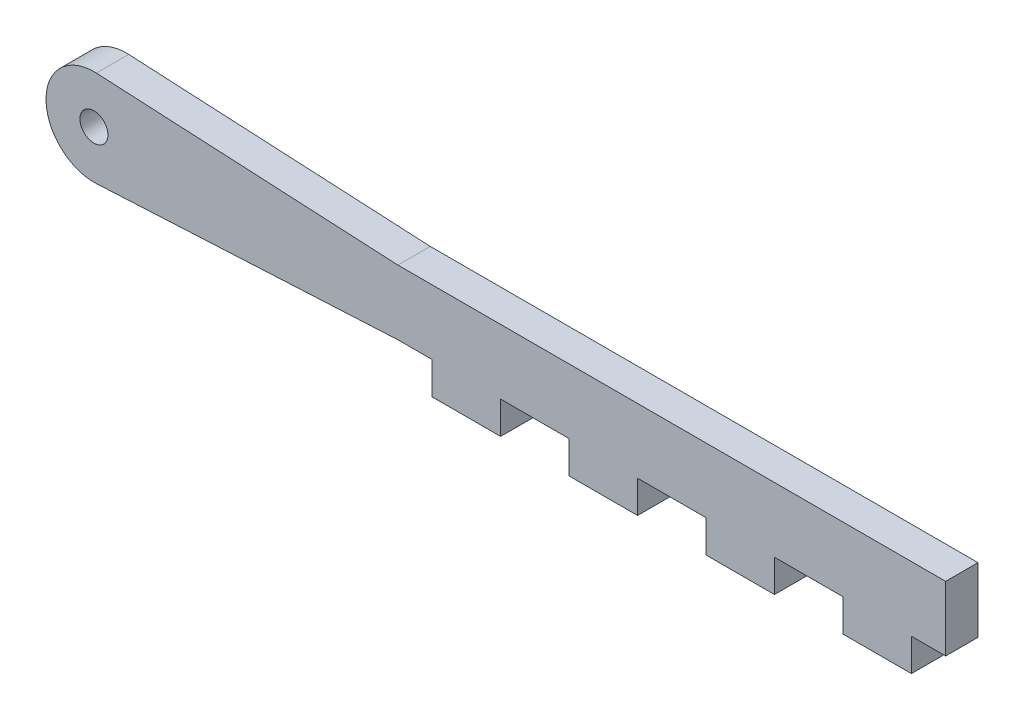
ISO-10303-21;
HEADER;
FILE_DESCRIPTION(('STEP AP214'),'2;1');
FILE_NAME('part.step','',(''),(''),'','','');
FILE_SCHEMA(('AUTOMOTIVE_DESIGN { 1 0 10303 214 1 1 1 1 }'));
ENDSEC;
DATA;
#1=APPLICATION_CONTEXT('core data for automotive mechanical design processes');
#2=APPLICATION_PROTOCOL_DEFINITION('international standard','automotive_design',2000,#1);
#3=PRODUCT_CONTEXT('',#1,'mechanical');
#4=PRODUCT('Part','Part','',(#3));
#5=PRODUCT_RELATED_PRODUCT_CATEGORY('part','',(#4));
#6=PRODUCT_DEFINITION_FORMATION('','',#4);
#7=PRODUCT_DEFINITION_CONTEXT('part definition',#1,'design');
#8=PRODUCT_DEFINITION('design','',#6,#7);
#9=PRODUCT_DEFINITION_SHAPE('','',#8);
#10=(LENGTH_UNIT() NAMED_UNIT(*) SI_UNIT(.MILLI.,.METRE.));
#11=(NAMED_UNIT(*) PLANE_ANGLE_UNIT() SI_UNIT($,.RADIAN.));
#12=(NAMED_UNIT(*) SI_UNIT($,.STERADIAN.) SOLID_ANGLE_UNIT());
#13=UNCERTAINTY_MEASURE_WITH_UNIT(LENGTH_MEASURE(1.E-05),#10,'distance_accuracy_value','');
#14=(GEOMETRIC_REPRESENTATION_CONTEXT(3) GLOBAL_UNCERTAINTY_ASSIGNED_CONTEXT((#13)) GLOBAL_UNIT_ASSIGNED_CONTEXT((#10,
#11,#12)) REPRESENTATION_CONTEXT('',''));
#15=CARTESIAN_POINT('',(0.,0.,0.));
#16=DIRECTION('',(0.,0.,1.));
#17=DIRECTION('',(1.,0.,0.));
#18=AXIS2_PLACEMENT_3D('',#15,#16,#17);
#19=CARTESIAN_POINT('',(50.8,0.,3.));
#20=DIRECTION('',(0.,1.,0.));
#21=DIRECTION('',(-1.,0.,0.));
#22=AXIS2_PLACEMENT_3D('',#19,#20,#21);
#23=PLANE('',#22);
#24=DIRECTION('',(0.,0.,-1.));
#25=VECTOR('',#24,1.);
#26=CARTESIAN_POINT('',(15.875,0.,3.));
#27=LINE('',#26,#25);
#28=CARTESIAN_POINT('',(15.875,0.,3.));
#29=VERTEX_POINT('',#28);
#30=CARTESIAN_POINT('',(15.875,0.,0.));
#31=VERTEX_POINT('',#30);
#32=EDGE_CURVE('E228',#29,#31,#27,.T.);
#33=ORIENTED_EDGE('',*,*,#32,.F.);
#34=DIRECTION('',(1.,0.,0.));
#35=VECTOR('',#34,1.);
#36=CARTESIAN_POINT('',(50.8,0.,3.));
#37=LINE('',#36,#35);
#38=CARTESIAN_POINT('',(9.525,0.,3.));
#39=VERTEX_POINT('',#38);
#40=EDGE_CURVE('E368',#39,#29,#37,.T.);
#41=ORIENTED_EDGE('',*,*,#40,.F.);
#42=DIRECTION('',(0.,0.,1.));
#43=VECTOR('',#42,1.);
#44=CARTESIAN_POINT('',(9.525,0.,3.));
#45=LINE('',#44,#43);
#46=CARTESIAN_POINT('',(9.525,0.,0.));
#47=VERTEX_POINT('',#46);
#48=EDGE_CURVE('E235',#47,#39,#45,.T.);
#49=ORIENTED_EDGE('',*,*,#48,.F.);
#50=DIRECTION('',(1.,0.,0.));
#51=VECTOR('',#50,1.);
#52=CARTESIAN_POINT('',(50.8,0.,0.));
#53=LINE('',#52,#51);
#54=EDGE_CURVE('E389',#47,#31,#53,.T.);
#55=ORIENTED_EDGE('',*,*,#54,.T.);
#56=EDGE_LOOP('',(#33,#41,#49,#55));
#57=FACE_BOUND('',#56,.T.);
#58=ADVANCED_FACE('F49',(#57),#23,.F.);
#59=DIRECTION('',(0.,0.,1.));
#60=VECTOR('',#59,1.);
#61=CARTESIAN_POINT('',(22.225,0.,3.));
#62=LINE('',#61,#60);
#63=CARTESIAN_POINT('',(22.225,0.,0.));
#64=VERTEX_POINT('',#63);
#65=CARTESIAN_POINT('',(22.225,0.,3.));
#66=VERTEX_POINT('',#65);
#67=EDGE_CURVE('E225',#64,#66,#62,.T.);
#68=ORIENTED_EDGE('',*,*,#67,.F.);
#69=CARTESIAN_POINT('',(28.575,0.,0.));
#70=VERTEX_POINT('',#69);
#71=EDGE_CURVE('E445',#64,#70,#53,.T.);
#72=ORIENTED_EDGE('',*,*,#71,.T.);
#73=DIRECTION('',(0.,0.,-1.));
#74=VECTOR('',#73,1.);
#75=CARTESIAN_POINT('',(28.575,0.,3.));
#76=LINE('',#75,#74);
#77=CARTESIAN_POINT('',(28.575,0.,3.));
#78=VERTEX_POINT('',#77);
#79=EDGE_CURVE('E256',#78,#70,#76,.T.);
#80=ORIENTED_EDGE('',*,*,#79,.F.);
#81=EDGE_CURVE('E509',#66,#78,#37,.T.);
#82=ORIENTED_EDGE('',*,*,#81,.F.);
#83=EDGE_LOOP('',(#68,#72,#80,#82));
#84=FACE_BOUND('',#83,.T.);
#85=ADVANCED_FACE('F477',(#84),#23,.F.);
#86=DIRECTION('',(0.,0.,1.));
#87=VECTOR('',#86,1.);
#88=CARTESIAN_POINT('',(34.925,0.,3.));
#89=LINE('',#88,#87);
#90=CARTESIAN_POINT('',(34.925,0.,0.));
#91=VERTEX_POINT('',#90);
#92=CARTESIAN_POINT('',(34.925,0.,3.));
#93=VERTEX_POINT('',#92);
#94=EDGE_CURVE('E246',#91,#93,#89,.T.);
#95=ORIENTED_EDGE('',*,*,#94,.F.);
#96=CARTESIAN_POINT('',(41.275,0.,0.));
#97=VERTEX_POINT('',#96);
#98=EDGE_CURVE('E443',#91,#97,#53,.T.);
#99=ORIENTED_EDGE('',*,*,#98,.T.);
#100=DIRECTION('',(0.,0.,-1.));
#101=VECTOR('',#100,1.);
#102=CARTESIAN_POINT('',(41.275,0.,3.));
#103=LINE('',#102,#101);
#104=CARTESIAN_POINT('',(41.275,0.,3.));
#105=VERTEX_POINT('',#104);
#106=EDGE_CURVE('E73',#105,#97,#103,.T.);
#107=ORIENTED_EDGE('',*,*,#106,.F.);
#108=EDGE_CURVE('E495',#93,#105,#37,.T.);
#109=ORIENTED_EDGE('',*,*,#108,.F.);
#110=EDGE_LOOP('',(#95,#99,#107,#109));
#111=FACE_BOUND('',#110,.T.);
#112=ADVANCED_FACE('F483',(#111),#23,.F.);
#113=DIRECTION('',(0.,0.,1.));
#114=VECTOR('',#113,1.);
#115=CARTESIAN_POINT('',(47.625,0.,3.));
#116=LINE('',#115,#114);
#117=CARTESIAN_POINT('',(47.625,0.,0.));
#118=VERTEX_POINT('',#117);
#119=CARTESIAN_POINT('',(47.625,0.,3.));
#120=VERTEX_POINT('',#119);
#121=EDGE_CURVE('E284',#118,#120,#116,.T.);
#122=ORIENTED_EDGE('',*,*,#121,.F.);
#123=CARTESIAN_POINT('',(50.8,0.,0.));
#124=VERTEX_POINT('',#123);
#125=EDGE_CURVE('E384',#118,#124,#53,.T.);
#126=ORIENTED_EDGE('',*,*,#125,.T.);
#127=DIRECTION('',(0.,0.,-1.));
#128=VECTOR('',#127,1.);
#129=CARTESIAN_POINT('',(50.8,0.,3.));
#130=LINE('',#129,#128);
#131=CARTESIAN_POINT('',(50.8,0.,3.));
#132=VERTEX_POINT('',#131);
#133=EDGE_CURVE('E395',#132,#124,#130,.T.);
#134=ORIENTED_EDGE('',*,*,#133,.F.);
#135=EDGE_CURVE('E65',#120,#132,#37,.T.);
#136=ORIENTED_EDGE('',*,*,#135,.F.);
#137=EDGE_LOOP('',(#122,#126,#134,#136));
#138=FACE_BOUND('',#137,.T.);
#139=ADVANCED_FACE('F441',(#138),#23,.F.);
#140=DIRECTION('',(0.,0.,-1.));
#141=VECTOR('',#140,1.);
#142=CARTESIAN_POINT('',(3.175,0.,3.));
#143=LINE('',#142,#141);
#144=CARTESIAN_POINT('',(3.175,0.,3.));
#145=VERTEX_POINT('',#144);
#146=CARTESIAN_POINT('',(3.175,0.,0.));
#147=VERTEX_POINT('',#146);
#148=EDGE_CURVE('E230',#145,#147,#143,.T.);
#149=ORIENTED_EDGE('',*,*,#148,.F.);
#150=CARTESIAN_POINT('',(0.,0.,3.));
#151=VERTEX_POINT('',#150);
#152=EDGE_CURVE('E363',#151,#145,#37,.T.);
#153=ORIENTED_EDGE('',*,*,#152,.F.);
#154=DIRECTION('',(0.,0.,-1.));
#155=VECTOR('',#154,1.);
#156=CARTESIAN_POINT('',(0.,0.,3.));
#157=LINE('',#156,#155);
#158=CARTESIAN_POINT('',(0.,0.,0.));
#159=VERTEX_POINT('',#158);
#160=EDGE_CURVE('E399',#151,#159,#157,.T.);
#161=ORIENTED_EDGE('',*,*,#160,.T.);
#162=EDGE_CURVE('E385',#159,#147,#53,.T.);
#163=ORIENTED_EDGE('',*,*,#162,.T.);
#164=EDGE_LOOP('',(#149,#153,#161,#163));
#165=FACE_BOUND('',#164,.T.);
#166=ADVANCED_FACE('F424',(#165),#23,.F.);
#167=CARTESIAN_POINT('',(-28.194,3.,3.));
#168=DIRECTION('',(0.,0.,1.));
#169=DIRECTION('',(1.,0.,0.));
#170=AXIS2_PLACEMENT_3D('',#167,#168,#169);
#171=PLANE('',#170);
#172=DIRECTION('',(-1.,0.,0.));
#173=VECTOR('',#172,1.);
#174=CARTESIAN_POINT('',(50.8,6.,3.));
#175=LINE('',#174,#173);
#176=CARTESIAN_POINT('',(50.8,6.,3.));
#177=VERTEX_POINT('',#176);
#178=CARTESIAN_POINT('',(0.,5.99999999999999,3.));
#179=VERTEX_POINT('',#178);
#180=EDGE_CURVE('E349',#177,#179,#175,.T.);
#181=ORIENTED_EDGE('',*,*,#180,.T.);
#182=DIRECTION('',(-0.998678524518852,0.0513926518565458,0.));
#183=VECTOR('',#182,1.);
#184=CARTESIAN_POINT('',(0.,5.99999999999999,3.));
#185=LINE('',#184,#183);
#186=CARTESIAN_POINT('',(-27.9655596624977,7.4391260414863,3.));
#187=VERTEX_POINT('',#186);
#188=EDGE_CURVE('E353',#179,#187,#185,.T.);
#189=ORIENTED_EDGE('',*,*,#188,.T.);
#190=CARTESIAN_POINT('',(-28.194,3.,3.));
#191=DIRECTION('',(0.,0.,1.));
#192=DIRECTION('',(1.,0.,0.));
#193=AXIS2_PLACEMENT_3D('',#190,#191,#192);
#194=CIRCLE('',#193,4.445);
#195=CARTESIAN_POINT('',(-27.9655596624977,-1.4391260414863,3.));
#196=VERTEX_POINT('',#195);
#197=EDGE_CURVE('E357',#187,#196,#194,.T.);
#198=ORIENTED_EDGE('',*,*,#197,.T.);
#199=DIRECTION('',(0.998678524518852,0.0513926518565454,0.));
#200=VECTOR('',#199,1.);
#201=CARTESIAN_POINT('',(0.,0.,3.));
#202=LINE('',#201,#200);
#203=EDGE_CURVE('E360',#196,#151,#202,.T.);
#204=ORIENTED_EDGE('',*,*,#203,.T.);
#205=ORIENTED_EDGE('',*,*,#152,.T.);
#206=DIRECTION('',(0.,1.,0.));
#207=VECTOR('',#206,1.);
#208=CARTESIAN_POINT('',(3.175,-3.,3.));
#209=LINE('',#208,#207);
#210=CARTESIAN_POINT('',(3.175,-3.,3.));
#211=VERTEX_POINT('',#210);
#212=EDGE_CURVE('E324',#211,#145,#209,.T.);
#213=ORIENTED_EDGE('',*,*,#212,.F.);
#214=DIRECTION('',(-1.,0.,0.));
#215=VECTOR('',#214,1.);
#216=CARTESIAN_POINT('',(3.175,-3.,3.));
#217=LINE('',#216,#215);
#218=CARTESIAN_POINT('',(9.525,-3.,3.));
#219=VERTEX_POINT('',#218);
#220=EDGE_CURVE('E322',#219,#211,#217,.T.);
#221=ORIENTED_EDGE('',*,*,#220,.F.);
#222=DIRECTION('',(0.,1.,0.));
#223=VECTOR('',#222,1.);
#224=CARTESIAN_POINT('',(9.525,-3.,3.));
#225=LINE('',#224,#223);
#226=EDGE_CURVE('E331',#219,#39,#225,.T.);
#227=ORIENTED_EDGE('',*,*,#226,.T.);
#228=ORIENTED_EDGE('',*,*,#40,.T.);
#229=DIRECTION('',(0.,1.,0.));
#230=VECTOR('',#229,1.);
#231=CARTESIAN_POINT('',(15.875,-3.,3.));
#232=LINE('',#231,#230);
#233=CARTESIAN_POINT('',(15.875,-3.,3.));
#234=VERTEX_POINT('',#233);
#235=EDGE_CURVE('E710',#234,#29,#232,.T.);
#236=ORIENTED_EDGE('',*,*,#235,.F.);
#237=DIRECTION('',(-1.,0.,0.));
#238=VECTOR('',#237,1.);
#239=CARTESIAN_POINT('',(15.875,-3.,3.));
#240=LINE('',#239,#238);
#241=CARTESIAN_POINT('',(22.225,-3.,3.));
#242=VERTEX_POINT('',#241);
#243=EDGE_CURVE('E220',#242,#234,#240,.T.);
#244=ORIENTED_EDGE('',*,*,#243,.F.);
#245=DIRECTION('',(0.,1.,0.));
#246=VECTOR('',#245,1.);
#247=CARTESIAN_POINT('',(22.225,-3.,3.));
#248=LINE('',#247,#246);
#249=EDGE_CURVE('E237',#242,#66,#248,.T.);
#250=ORIENTED_EDGE('',*,*,#249,.T.);
#251=ORIENTED_EDGE('',*,*,#81,.T.);
#252=DIRECTION('',(0.,1.,0.));
#253=VECTOR('',#252,1.);
#254=CARTESIAN_POINT('',(28.575,-3.,3.));
#255=LINE('',#254,#253);
#256=CARTESIAN_POINT('',(28.575,-3.,3.));
#257=VERTEX_POINT('',#256);
#258=EDGE_CURVE('E255',#257,#78,#255,.T.);
#259=ORIENTED_EDGE('',*,*,#258,.F.);
#260=DIRECTION('',(-1.,0.,0.));
#261=VECTOR('',#260,1.);
#262=CARTESIAN_POINT('',(28.575,-3.,3.));
#263=LINE('',#262,#261);
#264=CARTESIAN_POINT('',(34.925,-3.,3.));
#265=VERTEX_POINT('',#264);
#266=EDGE_CURVE('E252',#265,#257,#263,.T.);
#267=ORIENTED_EDGE('',*,*,#266,.F.);
#268=DIRECTION('',(0.,1.,0.));
#269=VECTOR('',#268,1.);
#270=CARTESIAN_POINT('',(34.925,-3.,3.));
#271=LINE('',#270,#269);
#272=EDGE_CURVE('E267',#265,#93,#271,.T.);
#273=ORIENTED_EDGE('',*,*,#272,.T.);
#274=ORIENTED_EDGE('',*,*,#108,.T.);
#275=DIRECTION('',(0.,1.,0.));
#276=VECTOR('',#275,1.);
#277=CARTESIAN_POINT('',(41.275,-3.,3.));
#278=LINE('',#277,#276);
#279=CARTESIAN_POINT('',(41.275,-3.,3.));
#280=VERTEX_POINT('',#279);
#281=EDGE_CURVE('E293',#280,#105,#278,.T.);
#282=ORIENTED_EDGE('',*,*,#281,.F.);
#283=DIRECTION('',(-1.,0.,0.));
#284=VECTOR('',#283,1.);
#285=CARTESIAN_POINT('',(41.275,-3.,3.));
#286=LINE('',#285,#284);
#287=CARTESIAN_POINT('',(47.625,-3.,3.));
#288=VERTEX_POINT('',#287);
#289=EDGE_CURVE('E290',#288,#280,#286,.T.);
#290=ORIENTED_EDGE('',*,*,#289,.F.);
#291=DIRECTION('',(0.,1.,0.));
#292=VECTOR('',#291,1.);
#293=CARTESIAN_POINT('',(47.625,-3.,3.));
#294=LINE('',#293,#292);
#295=EDGE_CURVE('E301',#288,#120,#294,.T.);
#296=ORIENTED_EDGE('',*,*,#295,.T.);
#297=ORIENTED_EDGE('',*,*,#135,.T.);
#298=DIRECTION('',(0.,1.,0.));
#299=VECTOR('',#298,1.);
#300=CARTESIAN_POINT('',(50.8,0.,3.));
#301=LINE('',#300,#299);
#302=EDGE_CURVE('E367',#132,#177,#301,.T.);
#303=ORIENTED_EDGE('',*,*,#302,.T.);
#304=EDGE_LOOP('',(#181,#189,#198,#204,#205,#213,#221,#227,#228,#236,#244,#250,#251,#259,#267,
#273,#274,#282,#290,#296,#297,#303));
#305=FACE_BOUND('',#304,.T.);
#306=CARTESIAN_POINT('',(-28.194,3.,3.));
#307=DIRECTION('',(0.,0.,1.));
#308=DIRECTION('',(1.,0.,0.));
#309=AXIS2_PLACEMENT_3D('',#306,#307,#308);
#310=CIRCLE('',#309,1.29999999999999);
#311=CARTESIAN_POINT('',(-26.894,3.,3.));
#312=VERTEX_POINT('',#311);
#313=EDGE_CURVE('E341',#312,#312,#310,.T.);
#314=ORIENTED_EDGE('',*,*,#313,.F.);
#315=EDGE_LOOP('',(#314));
#316=FACE_BOUND('',#315,.T.);
#317=ADVANCED_FACE('F427',(#305,#316),#171,.T.);
#318=CARTESIAN_POINT('',(-28.194,3.,0.));
#319=DIRECTION('',(0.,0.,1.));
#320=DIRECTION('',(1.,0.,0.));
#321=AXIS2_PLACEMENT_3D('',#318,#319,#320);
#322=PLANE('',#321);
#323=DIRECTION('',(-1.,0.,0.));
#324=VECTOR('',#323,1.);
#325=CARTESIAN_POINT('',(50.8,6.,0.));
#326=LINE('',#325,#324);
#327=CARTESIAN_POINT('',(50.8,6.,0.));
#328=VERTEX_POINT('',#327);
#329=CARTESIAN_POINT('',(0.,5.99999999999999,0.));
#330=VERTEX_POINT('',#329);
#331=EDGE_CURVE('E345',#328,#330,#326,.T.);
#332=ORIENTED_EDGE('',*,*,#331,.F.);
#333=DIRECTION('',(0.,1.,0.));
#334=VECTOR('',#333,1.);
#335=CARTESIAN_POINT('',(50.8,0.,0.));
#336=LINE('',#335,#334);
#337=EDGE_CURVE('E354',#124,#328,#336,.T.);
#338=ORIENTED_EDGE('',*,*,#337,.F.);
#339=ORIENTED_EDGE('',*,*,#125,.F.);
#340=DIRECTION('',(0.,1.,0.));
#341=VECTOR('',#340,1.);
#342=CARTESIAN_POINT('',(47.625,-3.,0.));
#343=LINE('',#342,#341);
#344=CARTESIAN_POINT('',(47.625,-3.,0.));
#345=VERTEX_POINT('',#344);
#346=EDGE_CURVE('E305',#345,#118,#343,.T.);
#347=ORIENTED_EDGE('',*,*,#346,.F.);
#348=DIRECTION('',(1.,0.,0.));
#349=VECTOR('',#348,1.);
#350=CARTESIAN_POINT('',(41.275,-3.,0.));
#351=LINE('',#350,#349);
#352=CARTESIAN_POINT('',(41.275,-3.,0.));
#353=VERTEX_POINT('',#352);
#354=EDGE_CURVE('E283',#353,#345,#351,.T.);
#355=ORIENTED_EDGE('',*,*,#354,.F.);
#356=DIRECTION('',(0.,1.,0.));
#357=VECTOR('',#356,1.);
#358=CARTESIAN_POINT('',(41.275,-3.,0.));
#359=LINE('',#358,#357);
#360=EDGE_CURVE('E260',#353,#97,#359,.T.);
#361=ORIENTED_EDGE('',*,*,#360,.T.);
#362=ORIENTED_EDGE('',*,*,#98,.F.);
#363=DIRECTION('',(0.,1.,0.));
#364=VECTOR('',#363,1.);
#365=CARTESIAN_POINT('',(34.925,-3.,0.));
#366=LINE('',#365,#364);
#367=CARTESIAN_POINT('',(34.925,-3.,0.));
#368=VERTEX_POINT('',#367);
#369=EDGE_CURVE('E271',#368,#91,#366,.T.);
#370=ORIENTED_EDGE('',*,*,#369,.F.);
#371=DIRECTION('',(1.,0.,0.));
#372=VECTOR('',#371,1.);
#373=CARTESIAN_POINT('',(28.575,-3.,0.));
#374=LINE('',#373,#372);
#375=CARTESIAN_POINT('',(28.575,-3.,0.));
#376=VERTEX_POINT('',#375);
#377=EDGE_CURVE('E245',#376,#368,#374,.T.);
#378=ORIENTED_EDGE('',*,*,#377,.F.);
#379=DIRECTION('',(0.,1.,0.));
#380=VECTOR('',#379,1.);
#381=CARTESIAN_POINT('',(28.575,-3.,0.));
#382=LINE('',#381,#380);
#383=EDGE_CURVE('E275',#376,#70,#382,.T.);
#384=ORIENTED_EDGE('',*,*,#383,.T.);
#385=ORIENTED_EDGE('',*,*,#71,.F.);
#386=DIRECTION('',(0.,1.,0.));
#387=VECTOR('',#386,1.);
#388=CARTESIAN_POINT('',(22.225,-3.,0.));
#389=LINE('',#388,#387);
#390=CARTESIAN_POINT('',(22.225,-3.,0.));
#391=VERTEX_POINT('',#390);
#392=EDGE_CURVE('E210',#391,#64,#389,.T.);
#393=ORIENTED_EDGE('',*,*,#392,.F.);
#394=DIRECTION('',(1.,0.,0.));
#395=VECTOR('',#394,1.);
#396=CARTESIAN_POINT('',(15.875,-3.,0.));
#397=LINE('',#396,#395);
#398=CARTESIAN_POINT('',(15.875,-3.,0.));
#399=VERTEX_POINT('',#398);
#400=EDGE_CURVE('E200',#399,#391,#397,.T.);
#401=ORIENTED_EDGE('',*,*,#400,.F.);
#402=DIRECTION('',(0.,1.,0.));
#403=VECTOR('',#402,1.);
#404=CARTESIAN_POINT('',(15.875,-3.,0.));
#405=LINE('',#404,#403);
#406=EDGE_CURVE('E207',#399,#31,#405,.T.);
#407=ORIENTED_EDGE('',*,*,#406,.T.);
#408=ORIENTED_EDGE('',*,*,#54,.F.);
#409=DIRECTION('',(0.,1.,0.));
#410=VECTOR('',#409,1.);
#411=CARTESIAN_POINT('',(9.525,-3.,0.));
#412=LINE('',#411,#410);
#413=CARTESIAN_POINT('',(9.525,-3.,0.));
#414=VERTEX_POINT('',#413);
#415=EDGE_CURVE('E334',#414,#47,#412,.T.);
#416=ORIENTED_EDGE('',*,*,#415,.F.);
#417=DIRECTION('',(1.,0.,0.));
#418=VECTOR('',#417,1.);
#419=CARTESIAN_POINT('',(3.175,-3.,0.));
#420=LINE('',#419,#418);
#421=CARTESIAN_POINT('',(3.175,-3.,0.));
#422=VERTEX_POINT('',#421);
#423=EDGE_CURVE('E316',#422,#414,#420,.T.);
#424=ORIENTED_EDGE('',*,*,#423,.F.);
#425=DIRECTION('',(0.,1.,0.));
#426=VECTOR('',#425,1.);
#427=CARTESIAN_POINT('',(3.175,-3.,0.));
#428=LINE('',#427,#426);
#429=EDGE_CURVE('E337',#422,#147,#428,.T.);
#430=ORIENTED_EDGE('',*,*,#429,.T.);
#431=ORIENTED_EDGE('',*,*,#162,.F.);
#432=DIRECTION('',(0.998678524518852,0.0513926518565454,0.));
#433=VECTOR('',#432,1.);
#434=CARTESIAN_POINT('',(0.,0.,0.));
#435=LINE('',#434,#433);
#436=CARTESIAN_POINT('',(-27.9655596624977,-1.4391260414863,0.));
#437=VERTEX_POINT('',#436);
#438=EDGE_CURVE('E381',#437,#159,#435,.T.);
#439=ORIENTED_EDGE('',*,*,#438,.F.);
#440=CARTESIAN_POINT('',(-28.194,3.,0.));
#441=DIRECTION('',(0.,0.,1.));
#442=DIRECTION('',(1.,0.,0.));
#443=AXIS2_PLACEMENT_3D('',#440,#441,#442);
#444=CIRCLE('',#443,4.445);
#445=CARTESIAN_POINT('',(-27.9655596624977,7.4391260414863,0.));
#446=VERTEX_POINT('',#445);
#447=EDGE_CURVE('E378',#446,#437,#444,.T.);
#448=ORIENTED_EDGE('',*,*,#447,.F.);
#449=DIRECTION('',(-0.998678524518852,0.0513926518565458,0.));
#450=VECTOR('',#449,1.);
#451=CARTESIAN_POINT('',(0.,5.99999999999999,0.));
#452=LINE('',#451,#450);
#453=EDGE_CURVE('E375',#330,#446,#452,.T.);
#454=ORIENTED_EDGE('',*,*,#453,.F.);
#455=EDGE_LOOP('',(#332,#338,#339,#347,#355,#361,#362,#370,#378,#384,#385,#393,#401,#407,#408,
#416,#424,#430,#431,#439,#448,#454));
#456=FACE_BOUND('',#455,.T.);
#457=CARTESIAN_POINT('',(-28.194,3.,0.));
#458=DIRECTION('',(0.,0.,1.));
#459=DIRECTION('',(1.,0.,0.));
#460=AXIS2_PLACEMENT_3D('',#457,#458,#459);
#461=CIRCLE('',#460,1.29999999999999);
#462=CARTESIAN_POINT('',(-26.894,3.,0.));
#463=VERTEX_POINT('',#462);
#464=EDGE_CURVE('E340',#463,#463,#461,.T.);
#465=ORIENTED_EDGE('',*,*,#464,.T.);
#466=EDGE_LOOP('',(#465));
#467=FACE_BOUND('',#466,.T.);
#468=ADVANCED_FACE('F203',(#456,#467),#322,.F.);
#469=CARTESIAN_POINT('',(50.8,6.,3.));
#470=DIRECTION('',(0.,-1.,0.));
#471=DIRECTION('',(1.,0.,0.));
#472=AXIS2_PLACEMENT_3D('',#469,#470,#471);
#473=PLANE('',#472);
#474=ORIENTED_EDGE('',*,*,#331,.T.);
#475=DIRECTION('',(0.,0.,-1.));
#476=VECTOR('',#475,1.);
#477=CARTESIAN_POINT('',(0.,5.99999999999999,3.));
#478=LINE('',#477,#476);
#479=EDGE_CURVE('E11',#179,#330,#478,.T.);
#480=ORIENTED_EDGE('',*,*,#479,.F.);
#481=ORIENTED_EDGE('',*,*,#180,.F.);
#482=DIRECTION('',(0.,0.,-1.));
#483=VECTOR('',#482,1.);
#484=CARTESIAN_POINT('',(50.8,6.,3.));
#485=LINE('',#484,#483);
#486=EDGE_CURVE('E371',#177,#328,#485,.T.);
#487=ORIENTED_EDGE('',*,*,#486,.T.);
#488=EDGE_LOOP('',(#474,#480,#481,#487));
#489=FACE_BOUND('',#488,.T.);
#490=ADVANCED_FACE('F51',(#489),#473,.F.);
#491=CARTESIAN_POINT('',(0.,5.99999999999999,3.));
#492=DIRECTION('',(-0.0513926518565458,-0.998678524518852,0.));
#493=DIRECTION('',(0.998678524518852,-0.0513926518565458,0.));
#494=AXIS2_PLACEMENT_3D('',#491,#492,#493);
#495=PLANE('',#494);
#496=ORIENTED_EDGE('',*,*,#453,.T.);
#497=DIRECTION('',(0.,0.,-1.));
#498=VECTOR('',#497,1.);
#499=CARTESIAN_POINT('',(-27.9655596624977,7.4391260414863,3.));
#500=LINE('',#499,#498);
#501=EDGE_CURVE('E58',#187,#446,#500,.T.);
#502=ORIENTED_EDGE('',*,*,#501,.F.);
#503=ORIENTED_EDGE('',*,*,#188,.F.);
#504=ORIENTED_EDGE('',*,*,#479,.T.);
#505=EDGE_LOOP('',(#496,#502,#503,#504));
#506=FACE_BOUND('',#505,.T.);
#507=ADVANCED_FACE('F433',(#506),#495,.F.);
#508=CARTESIAN_POINT('',(-28.194,3.,3.));
#509=DIRECTION('',(0.,0.,-1.));
#510=DIRECTION('',(-1.,0.,0.));
#511=AXIS2_PLACEMENT_3D('',#508,#509,#510);
#512=CYLINDRICAL_SURFACE('',#511,4.445);
#513=ORIENTED_EDGE('',*,*,#447,.T.);
#514=DIRECTION('',(0.,0.,-1.));
#515=VECTOR('',#514,1.);
#516=CARTESIAN_POINT('',(-27.9655596624977,-1.4391260414863,3.));
#517=LINE('',#516,#515);
#518=EDGE_CURVE('E403',#196,#437,#517,.T.);
#519=ORIENTED_EDGE('',*,*,#518,.F.);
#520=ORIENTED_EDGE('',*,*,#197,.F.);
#521=ORIENTED_EDGE('',*,*,#501,.T.);
#522=EDGE_LOOP('',(#513,#519,#520,#521));
#523=FACE_BOUND('',#522,.T.);
#524=ADVANCED_FACE('F412',(#523),#512,.T.);
#525=CARTESIAN_POINT('',(0.,0.,3.));
#526=DIRECTION('',(-0.0513926518565454,0.998678524518852,0.));
#527=DIRECTION('',(-0.998678524518852,-0.0513926518565454,0.));
#528=AXIS2_PLACEMENT_3D('',#525,#526,#527);
#529=PLANE('',#528);
#530=ORIENTED_EDGE('',*,*,#438,.T.);
#531=ORIENTED_EDGE('',*,*,#160,.F.);
#532=ORIENTED_EDGE('',*,*,#203,.F.);
#533=ORIENTED_EDGE('',*,*,#518,.T.);
#534=EDGE_LOOP('',(#530,#531,#532,#533));
#535=FACE_BOUND('',#534,.T.);
#536=ADVANCED_FACE('F419',(#535),#529,.F.);
#537=CARTESIAN_POINT('',(50.8,0.,3.));
#538=DIRECTION('',(-1.,0.,0.));
#539=DIRECTION('',(0.,0.,1.));
#540=AXIS2_PLACEMENT_3D('',#537,#538,#539);
#541=PLANE('',#540);
#542=ORIENTED_EDGE('',*,*,#337,.T.);
#543=ORIENTED_EDGE('',*,*,#486,.F.);
#544=ORIENTED_EDGE('',*,*,#302,.F.);
#545=ORIENTED_EDGE('',*,*,#133,.T.);
#546=EDGE_LOOP('',(#542,#543,#544,#545));
#547=FACE_BOUND('',#546,.T.);
#548=ADVANCED_FACE('F439',(#547),#541,.F.);
#549=CARTESIAN_POINT('',(-28.194,3.,3.));
#550=DIRECTION('',(0.,0.,-1.));
#551=DIRECTION('',(-1.,0.,0.));
#552=AXIS2_PLACEMENT_3D('',#549,#550,#551);
#553=CYLINDRICAL_SURFACE('',#552,1.29999999999999);
#554=ORIENTED_EDGE('',*,*,#313,.T.);
#555=EDGE_LOOP('',(#554));
#556=FACE_BOUND('',#555,.T.);
#557=ORIENTED_EDGE('',*,*,#464,.F.);
#558=EDGE_LOOP('',(#557));
#559=FACE_BOUND('',#558,.T.);
#560=ADVANCED_FACE('F466',(#556,#559),#553,.F.);
#561=CARTESIAN_POINT('',(3.175,-3.,3.));
#562=DIRECTION('',(1.,0.,0.));
#563=DIRECTION('',(0.,0.,-1.));
#564=AXIS2_PLACEMENT_3D('',#561,#562,#563);
#565=PLANE('',#564);
#566=ORIENTED_EDGE('',*,*,#148,.T.);
#567=ORIENTED_EDGE('',*,*,#429,.F.);
#568=DIRECTION('',(0.,0.,-1.));
#569=VECTOR('',#568,1.);
#570=CARTESIAN_POINT('',(3.175,-3.,3.));
#571=LINE('',#570,#569);
#572=EDGE_CURVE('E312',#211,#422,#571,.T.);
#573=ORIENTED_EDGE('',*,*,#572,.F.);
#574=ORIENTED_EDGE('',*,*,#212,.T.);
#575=EDGE_LOOP('',(#566,#567,#573,#574));
#576=FACE_BOUND('',#575,.T.);
#577=ADVANCED_FACE('F464',(#576),#565,.F.);
#578=CARTESIAN_POINT('',(9.525,-3.,3.));
#579=DIRECTION('',(-1.,0.,0.));
#580=DIRECTION('',(0.,-1.,0.));
#581=AXIS2_PLACEMENT_3D('',#578,#579,#580);
#582=PLANE('',#581);
#583=ORIENTED_EDGE('',*,*,#48,.T.);
#584=ORIENTED_EDGE('',*,*,#226,.F.);
#585=DIRECTION('',(0.,0.,1.));
#586=VECTOR('',#585,1.);
#587=CARTESIAN_POINT('',(9.525,-3.,3.));
#588=LINE('',#587,#586);
#589=EDGE_CURVE('E319',#414,#219,#588,.T.);
#590=ORIENTED_EDGE('',*,*,#589,.F.);
#591=ORIENTED_EDGE('',*,*,#415,.T.);
#592=EDGE_LOOP('',(#583,#584,#590,#591));
#593=FACE_BOUND('',#592,.T.);
#594=ADVANCED_FACE('F459',(#593),#582,.F.);
#595=CARTESIAN_POINT('',(0.,-3.,0.));
#596=DIRECTION('',(0.,-1.,0.));
#597=DIRECTION('',(1.,0.,0.));
#598=AXIS2_PLACEMENT_3D('',#595,#596,#597);
#599=PLANE('',#598);
#600=ORIENTED_EDGE('',*,*,#572,.T.);
#601=ORIENTED_EDGE('',*,*,#423,.T.);
#602=ORIENTED_EDGE('',*,*,#589,.T.);
#603=ORIENTED_EDGE('',*,*,#220,.T.);
#604=EDGE_LOOP('',(#600,#601,#602,#603));
#605=FACE_BOUND('',#604,.T.);
#606=ADVANCED_FACE('F461',(#605),#599,.T.);
#607=CARTESIAN_POINT('',(41.275,-3.,3.));
#608=DIRECTION('',(1.,0.,0.));
#609=DIRECTION('',(0.,0.,-1.));
#610=AXIS2_PLACEMENT_3D('',#607,#608,#609);
#611=PLANE('',#610);
#612=ORIENTED_EDGE('',*,*,#106,.T.);
#613=ORIENTED_EDGE('',*,*,#360,.F.);
#614=DIRECTION('',(0.,0.,-1.));
#615=VECTOR('',#614,1.);
#616=CARTESIAN_POINT('',(41.275,-3.,3.));
#617=LINE('',#616,#615);
#618=EDGE_CURVE('E279',#280,#353,#617,.T.);
#619=ORIENTED_EDGE('',*,*,#618,.F.);
#620=ORIENTED_EDGE('',*,*,#281,.T.);
#621=EDGE_LOOP('',(#612,#613,#619,#620));
#622=FACE_BOUND('',#621,.T.);
#623=ADVANCED_FACE('F504',(#622),#611,.F.);
#624=CARTESIAN_POINT('',(47.625,-3.,3.));
#625=DIRECTION('',(-1.,0.,0.));
#626=DIRECTION('',(0.,-1.,0.));
#627=AXIS2_PLACEMENT_3D('',#624,#625,#626);
#628=PLANE('',#627);
#629=ORIENTED_EDGE('',*,*,#121,.T.);
#630=ORIENTED_EDGE('',*,*,#295,.F.);
#631=DIRECTION('',(0.,0.,1.));
#632=VECTOR('',#631,1.);
#633=CARTESIAN_POINT('',(47.625,-3.,3.));
#634=LINE('',#633,#632);
#635=EDGE_CURVE('E287',#345,#288,#634,.T.);
#636=ORIENTED_EDGE('',*,*,#635,.F.);
#637=ORIENTED_EDGE('',*,*,#346,.T.);
#638=EDGE_LOOP('',(#629,#630,#636,#637));
#639=FACE_BOUND('',#638,.T.);
#640=ADVANCED_FACE('F516',(#639),#628,.F.);
#641=CARTESIAN_POINT('',(38.1,-3.,0.));
#642=DIRECTION('',(0.,-1.,0.));
#643=DIRECTION('',(1.,0.,0.));
#644=AXIS2_PLACEMENT_3D('',#641,#642,#643);
#645=PLANE('',#644);
#646=ORIENTED_EDGE('',*,*,#618,.T.);
#647=ORIENTED_EDGE('',*,*,#354,.T.);
#648=ORIENTED_EDGE('',*,*,#635,.T.);
#649=ORIENTED_EDGE('',*,*,#289,.T.);
#650=EDGE_LOOP('',(#646,#647,#648,#649));
#651=FACE_BOUND('',#650,.T.);
#652=ADVANCED_FACE('F518',(#651),#645,.T.);
#653=CARTESIAN_POINT('',(28.575,-3.,3.));
#654=DIRECTION('',(1.,0.,0.));
#655=DIRECTION('',(0.,0.,-1.));
#656=AXIS2_PLACEMENT_3D('',#653,#654,#655);
#657=PLANE('',#656);
#658=ORIENTED_EDGE('',*,*,#79,.T.);
#659=ORIENTED_EDGE('',*,*,#383,.F.);
#660=DIRECTION('',(0.,0.,-1.));
#661=VECTOR('',#660,1.);
#662=CARTESIAN_POINT('',(28.575,-3.,3.));
#663=LINE('',#662,#661);
#664=EDGE_CURVE('E241',#257,#376,#663,.T.);
#665=ORIENTED_EDGE('',*,*,#664,.F.);
#666=ORIENTED_EDGE('',*,*,#258,.T.);
#667=EDGE_LOOP('',(#658,#659,#665,#666));
#668=FACE_BOUND('',#667,.T.);
#669=ADVANCED_FACE('F520',(#668),#657,.F.);
#670=CARTESIAN_POINT('',(34.925,-3.,3.));
#671=DIRECTION('',(-1.,0.,0.));
#672=DIRECTION('',(0.,-1.,0.));
#673=AXIS2_PLACEMENT_3D('',#670,#671,#672);
#674=PLANE('',#673);
#675=ORIENTED_EDGE('',*,*,#94,.T.);
#676=ORIENTED_EDGE('',*,*,#272,.F.);
#677=DIRECTION('',(0.,0.,1.));
#678=VECTOR('',#677,1.);
#679=CARTESIAN_POINT('',(34.925,-3.,3.));
#680=LINE('',#679,#678);
#681=EDGE_CURVE('E249',#368,#265,#680,.T.);
#682=ORIENTED_EDGE('',*,*,#681,.F.);
#683=ORIENTED_EDGE('',*,*,#369,.T.);
#684=EDGE_LOOP('',(#675,#676,#682,#683));
#685=FACE_BOUND('',#684,.T.);
#686=ADVANCED_FACE('F500',(#685),#674,.F.);
#687=CARTESIAN_POINT('',(25.4,-3.,0.));
#688=DIRECTION('',(0.,-1.,0.));
#689=DIRECTION('',(1.,0.,0.));
#690=AXIS2_PLACEMENT_3D('',#687,#688,#689);
#691=PLANE('',#690);
#692=ORIENTED_EDGE('',*,*,#664,.T.);
#693=ORIENTED_EDGE('',*,*,#377,.T.);
#694=ORIENTED_EDGE('',*,*,#681,.T.);
#695=ORIENTED_EDGE('',*,*,#266,.T.);
#696=EDGE_LOOP('',(#692,#693,#694,#695));
#697=FACE_BOUND('',#696,.T.);
#698=ADVANCED_FACE('F664',(#697),#691,.T.);
#699=CARTESIAN_POINT('',(15.875,-3.,3.));
#700=DIRECTION('',(1.,0.,0.));
#701=DIRECTION('',(0.,0.,-1.));
#702=AXIS2_PLACEMENT_3D('',#699,#700,#701);
#703=PLANE('',#702);
#704=ORIENTED_EDGE('',*,*,#32,.T.);
#705=ORIENTED_EDGE('',*,*,#406,.F.);
#706=DIRECTION('',(0.,0.,-1.));
#707=VECTOR('',#706,1.);
#708=CARTESIAN_POINT('',(15.875,-3.,3.));
#709=LINE('',#708,#707);
#710=EDGE_CURVE('E215',#234,#399,#709,.T.);
#711=ORIENTED_EDGE('',*,*,#710,.F.);
#712=ORIENTED_EDGE('',*,*,#235,.T.);
#713=EDGE_LOOP('',(#704,#705,#711,#712));
#714=FACE_BOUND('',#713,.T.);
#715=ADVANCED_FACE('F227',(#714),#703,.F.);
#716=CARTESIAN_POINT('',(22.225,-3.,3.));
#717=DIRECTION('',(-1.,0.,0.));
#718=DIRECTION('',(0.,-1.,0.));
#719=AXIS2_PLACEMENT_3D('',#716,#717,#718);
#720=PLANE('',#719);
#721=ORIENTED_EDGE('',*,*,#67,.T.);
#722=ORIENTED_EDGE('',*,*,#249,.F.);
#723=DIRECTION('',(0.,0.,1.));
#724=VECTOR('',#723,1.);
#725=CARTESIAN_POINT('',(22.225,-3.,3.));
#726=LINE('',#725,#724);
#727=EDGE_CURVE('E214',#391,#242,#726,.T.);
#728=ORIENTED_EDGE('',*,*,#727,.F.);
#729=ORIENTED_EDGE('',*,*,#392,.T.);
#730=EDGE_LOOP('',(#721,#722,#728,#729));
#731=FACE_BOUND('',#730,.T.);
#732=ADVANCED_FACE('F679',(#731),#720,.F.);
#733=CARTESIAN_POINT('',(12.7,-3.,0.));
#734=DIRECTION('',(0.,-1.,0.));
#735=DIRECTION('',(1.,0.,0.));
#736=AXIS2_PLACEMENT_3D('',#733,#734,#735);
#737=PLANE('',#736);
#738=ORIENTED_EDGE('',*,*,#710,.T.);
#739=ORIENTED_EDGE('',*,*,#400,.T.);
#740=ORIENTED_EDGE('',*,*,#727,.T.);
#741=ORIENTED_EDGE('',*,*,#243,.T.);
#742=EDGE_LOOP('',(#738,#739,#740,#741));
#743=FACE_BOUND('',#742,.T.);
#744=ADVANCED_FACE('F218',(#743),#737,.T.);
#745=CLOSED_SHELL('',(#58,#85,#112,#139,#166,#317,#468,#490,#507,#524,#536,#548,#560,#577,#594,
#606,#623,#640,#652,#669,#686,#698,#715,#732,#744));
#746=MANIFOLD_SOLID_BREP('B2',#745);
#747=ADVANCED_BREP_SHAPE_REPRESENTATION('',(#18,#746),#14);
#748=SHAPE_DEFINITION_REPRESENTATION(#9,#747);
ENDSEC;
END-ISO-10303-21;
